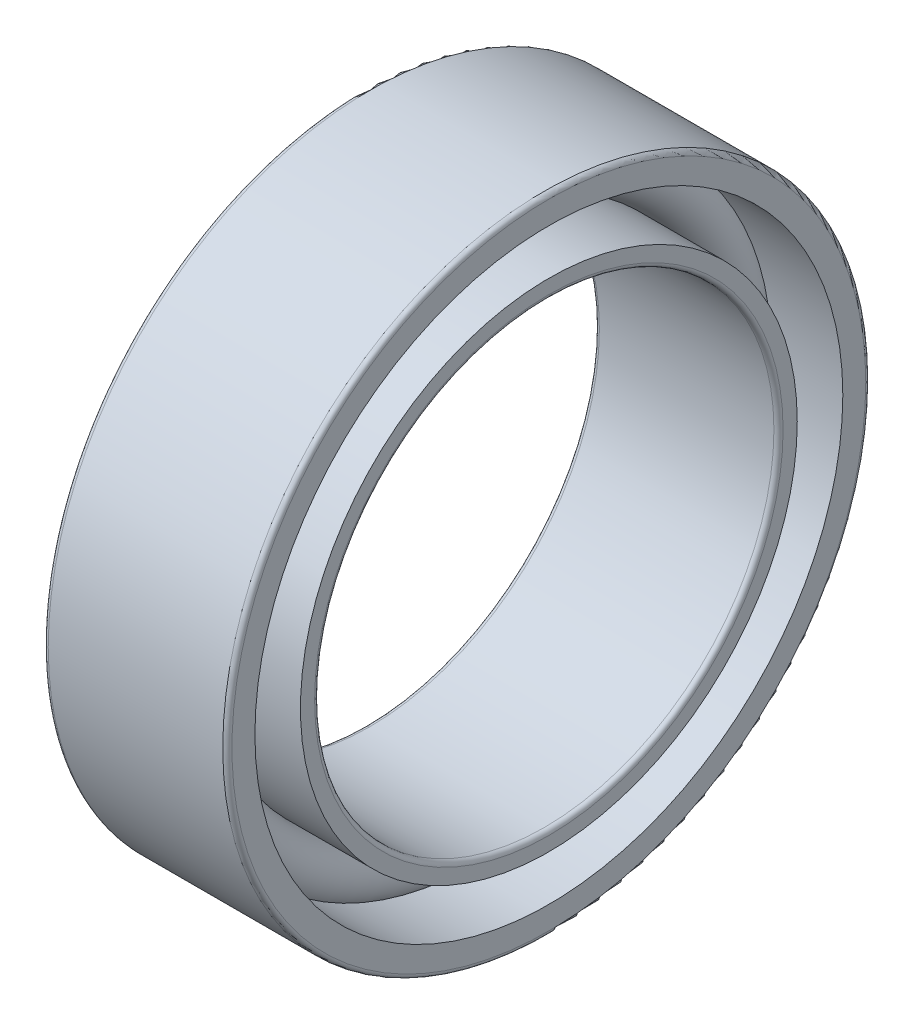
ISO-10303-21;
HEADER;
FILE_DESCRIPTION(('STEP AP214'),'2;1');
FILE_NAME('part.step','',(''),(''),'','','');
FILE_SCHEMA(('AUTOMOTIVE_DESIGN { 1 0 10303 214 1 1 1 1 }'));
ENDSEC;
DATA;
#1=APPLICATION_CONTEXT('core data for automotive mechanical design processes');
#2=APPLICATION_PROTOCOL_DEFINITION('international standard','automotive_design',2000,#1);
#3=PRODUCT_CONTEXT('',#1,'mechanical');
#4=PRODUCT('Part','Part','',(#3));
#5=PRODUCT_RELATED_PRODUCT_CATEGORY('part','',(#4));
#6=PRODUCT_DEFINITION_FORMATION('','',#4);
#7=PRODUCT_DEFINITION_CONTEXT('part definition',#1,'design');
#8=PRODUCT_DEFINITION('design','',#6,#7);
#9=PRODUCT_DEFINITION_SHAPE('','',#8);
#10=(LENGTH_UNIT() NAMED_UNIT(*) SI_UNIT(.MILLI.,.METRE.));
#11=(NAMED_UNIT(*) PLANE_ANGLE_UNIT() SI_UNIT($,.RADIAN.));
#12=(NAMED_UNIT(*) SI_UNIT($,.STERADIAN.) SOLID_ANGLE_UNIT());
#13=UNCERTAINTY_MEASURE_WITH_UNIT(LENGTH_MEASURE(1.E-05),#10,'distance_accuracy_value','');
#14=(GEOMETRIC_REPRESENTATION_CONTEXT(3) GLOBAL_UNCERTAINTY_ASSIGNED_CONTEXT((#13)) GLOBAL_UNIT_ASSIGNED_CONTEXT((#10,
#11,#12)) REPRESENTATION_CONTEXT('',''));
#15=CARTESIAN_POINT('',(0.,0.,0.));
#16=DIRECTION('',(0.,0.,1.));
#17=DIRECTION('',(1.,0.,0.));
#18=AXIS2_PLACEMENT_3D('',#15,#16,#17);
#19=CARTESIAN_POINT('',(0.,0.,0.));
#20=DIRECTION('',(-1.,0.,0.));
#21=DIRECTION('',(0.,0.,1.));
#22=AXIS2_PLACEMENT_3D('',#19,#20,#21);
#23=TOROIDAL_SURFACE('',#22,18.,1.8);
#24=CARTESIAN_POINT('',(1.34164078649987,0.,0.));
#25=DIRECTION('',(-1.,0.,0.));
#26=DIRECTION('',(0.,0.,1.));
#27=AXIS2_PLACEMENT_3D('',#24,#25,#26);
#28=CIRCLE('',#27,19.2);
#29=CARTESIAN_POINT('',(1.34164078649987,0.,19.2));
#30=VERTEX_POINT('',#29);
#31=EDGE_CURVE('E36',#30,#30,#28,.F.);
#32=ORIENTED_EDGE('',*,*,#31,.T.);
#33=EDGE_LOOP('',(#32));
#34=FACE_BOUND('',#33,.T.);
#35=CARTESIAN_POINT('',(0.29895651857754,0.,0.));
#36=DIRECTION('',(-1.,0.,0.));
#37=DIRECTION('',(0.,0.,1.));
#38=AXIS2_PLACEMENT_3D('',#35,#36,#37);
#39=CIRCLE('',#38,16.225);
#40=CARTESIAN_POINT('',(0.29895651857754,0.,16.225));
#41=VERTEX_POINT('',#40);
#42=EDGE_CURVE('E10',#41,#41,#39,.T.);
#43=ORIENTED_EDGE('',*,*,#42,.T.);
#44=EDGE_LOOP('',(#43));
#45=FACE_BOUND('',#44,.T.);
#46=ADVANCED_FACE('F32',(#34,#45),#23,.T.);
#47=CARTESIAN_POINT('',(-20.6375,0.,0.));
#48=DIRECTION('',(1.,0.,0.));
#49=DIRECTION('',(0.,0.,-1.));
#50=AXIS2_PLACEMENT_3D('',#47,#48,#49);
#51=CYLINDRICAL_SURFACE('',#50,16.225);
#52=CARTESIAN_POINT('',(6.,0.,0.));
#53=DIRECTION('',(1.,0.,0.));
#54=DIRECTION('',(0.,0.,-1.));
#55=AXIS2_PLACEMENT_3D('',#52,#53,#54);
#56=CIRCLE('',#55,16.225);
#57=CARTESIAN_POINT('',(6.,0.,-16.225));
#58=VERTEX_POINT('',#57);
#59=EDGE_CURVE('E45',#58,#58,#56,.T.);
#60=ORIENTED_EDGE('',*,*,#59,.F.);
#61=EDGE_LOOP('',(#60));
#62=FACE_BOUND('',#61,.T.);
#63=ORIENTED_EDGE('',*,*,#42,.F.);
#64=EDGE_LOOP('',(#63));
#65=FACE_BOUND('',#64,.T.);
#66=ADVANCED_FACE('F84',(#62,#65),#51,.T.);
#67=CARTESIAN_POINT('',(-20.6375,0.,0.));
#68=DIRECTION('',(1.,0.,0.));
#69=DIRECTION('',(0.,0.,-1.));
#70=AXIS2_PLACEMENT_3D('',#67,#68,#69);
#71=CYLINDRICAL_SURFACE('',#70,16.8);
#72=CARTESIAN_POINT('',(-6.,0.,0.));
#73=DIRECTION('',(1.,0.,0.));
#74=DIRECTION('',(0.,0.,-1.));
#75=AXIS2_PLACEMENT_3D('',#72,#73,#74);
#76=CIRCLE('',#75,16.8);
#77=CARTESIAN_POINT('',(-6.,0.,-16.8));
#78=VERTEX_POINT('',#77);
#79=EDGE_CURVE('E54',#78,#78,#76,.T.);
#80=ORIENTED_EDGE('',*,*,#79,.T.);
#81=EDGE_LOOP('',(#80));
#82=FACE_BOUND('',#81,.T.);
#83=CARTESIAN_POINT('',(-1.34164078649988,0.,0.));
#84=DIRECTION('',(1.,0.,0.));
#85=DIRECTION('',(0.,0.,-1.));
#86=AXIS2_PLACEMENT_3D('',#83,#84,#85);
#87=CIRCLE('',#86,16.8);
#88=CARTESIAN_POINT('',(-1.34164078649988,0.,-16.8));
#89=VERTEX_POINT('',#88);
#90=EDGE_CURVE('E40',#89,#89,#87,.T.);
#91=ORIENTED_EDGE('',*,*,#90,.F.);
#92=EDGE_LOOP('',(#91));
#93=FACE_BOUND('',#92,.T.);
#94=ADVANCED_FACE('F87',(#82,#93),#71,.T.);
#95=CARTESIAN_POINT('',(6.,15.3,0.));
#96=DIRECTION('',(1.,0.,0.));
#97=DIRECTION('',(0.,0.,-1.));
#98=AXIS2_PLACEMENT_3D('',#95,#96,#97);
#99=PLANE('',#98);
#100=ORIENTED_EDGE('',*,*,#59,.T.);
#101=EDGE_LOOP('',(#100));
#102=FACE_BOUND('',#101,.T.);
#103=CARTESIAN_POINT('',(6.,0.,0.));
#104=DIRECTION('',(1.,0.,0.));
#105=DIRECTION('',(0.,0.,-1.));
#106=AXIS2_PLACEMENT_3D('',#103,#104,#105);
#107=CIRCLE('',#106,15.3);
#108=CARTESIAN_POINT('',(6.,0.,-15.3));
#109=VERTEX_POINT('',#108);
#110=EDGE_CURVE('E76',#109,#109,#107,.T.);
#111=ORIENTED_EDGE('',*,*,#110,.F.);
#112=EDGE_LOOP('',(#111));
#113=FACE_BOUND('',#112,.T.);
#114=ADVANCED_FACE('F81',(#102,#113),#99,.T.);
#115=CARTESIAN_POINT('',(5.7,0.,0.));
#116=DIRECTION('',(1.,0.,0.));
#117=DIRECTION('',(0.,0.,-1.));
#118=AXIS2_PLACEMENT_3D('',#115,#116,#117);
#119=TOROIDAL_SURFACE('',#118,15.3,0.299999999999999);
#120=ORIENTED_EDGE('',*,*,#110,.T.);
#121=EDGE_LOOP('',(#120));
#122=FACE_BOUND('',#121,.T.);
#123=CARTESIAN_POINT('',(5.7,0.,0.));
#124=DIRECTION('',(1.,0.,0.));
#125=DIRECTION('',(0.,0.,-1.));
#126=AXIS2_PLACEMENT_3D('',#123,#124,#125);
#127=CIRCLE('',#126,15.);
#128=CARTESIAN_POINT('',(5.7,0.,-15.));
#129=VERTEX_POINT('',#128);
#130=EDGE_CURVE('E73',#129,#129,#127,.T.);
#131=ORIENTED_EDGE('',*,*,#130,.F.);
#132=EDGE_LOOP('',(#131));
#133=FACE_BOUND('',#132,.T.);
#134=ADVANCED_FACE('F98',(#122,#133),#119,.T.);
#135=CARTESIAN_POINT('',(-20.6375,0.,0.));
#136=DIRECTION('',(1.,0.,0.));
#137=DIRECTION('',(0.,0.,-1.));
#138=AXIS2_PLACEMENT_3D('',#135,#136,#137);
#139=CYLINDRICAL_SURFACE('',#138,15.);
#140=ORIENTED_EDGE('',*,*,#130,.T.);
#141=EDGE_LOOP('',(#140));
#142=FACE_BOUND('',#141,.T.);
#143=CARTESIAN_POINT('',(-5.7,0.,0.));
#144=DIRECTION('',(1.,0.,0.));
#145=DIRECTION('',(0.,0.,-1.));
#146=AXIS2_PLACEMENT_3D('',#143,#144,#145);
#147=CIRCLE('',#146,15.);
#148=CARTESIAN_POINT('',(-5.7,0.,-15.));
#149=VERTEX_POINT('',#148);
#150=EDGE_CURVE('E70',#149,#149,#147,.T.);
#151=ORIENTED_EDGE('',*,*,#150,.F.);
#152=EDGE_LOOP('',(#151));
#153=FACE_BOUND('',#152,.T.);
#154=ADVANCED_FACE('F101',(#142,#153),#139,.F.);
#155=CARTESIAN_POINT('',(-5.7,0.,0.));
#156=DIRECTION('',(1.,0.,0.));
#157=DIRECTION('',(0.,0.,-1.));
#158=AXIS2_PLACEMENT_3D('',#155,#156,#157);
#159=TOROIDAL_SURFACE('',#158,15.3,0.299999999999999);
#160=ORIENTED_EDGE('',*,*,#150,.T.);
#161=EDGE_LOOP('',(#160));
#162=FACE_BOUND('',#161,.T.);
#163=CARTESIAN_POINT('',(-6.,0.,0.));
#164=DIRECTION('',(1.,0.,0.));
#165=DIRECTION('',(0.,0.,-1.));
#166=AXIS2_PLACEMENT_3D('',#163,#164,#165);
#167=CIRCLE('',#166,15.3);
#168=CARTESIAN_POINT('',(-6.,0.,-15.3));
#169=VERTEX_POINT('',#168);
#170=EDGE_CURVE('E67',#169,#169,#167,.T.);
#171=ORIENTED_EDGE('',*,*,#170,.F.);
#172=EDGE_LOOP('',(#171));
#173=FACE_BOUND('',#172,.T.);
#174=ADVANCED_FACE('F105',(#162,#173),#159,.T.);
#175=CARTESIAN_POINT('',(-6.,16.8,0.));
#176=DIRECTION('',(-1.,0.,0.));
#177=DIRECTION('',(0.,0.,1.));
#178=AXIS2_PLACEMENT_3D('',#175,#176,#177);
#179=PLANE('',#178);
#180=ORIENTED_EDGE('',*,*,#170,.T.);
#181=EDGE_LOOP('',(#180));
#182=FACE_BOUND('',#181,.T.);
#183=ORIENTED_EDGE('',*,*,#79,.F.);
#184=EDGE_LOOP('',(#183));
#185=FACE_BOUND('',#184,.T.);
#186=ADVANCED_FACE('F109',(#182,#185),#179,.T.);
#187=CARTESIAN_POINT('',(-0.29895651857754,0.,0.));
#188=DIRECTION('',(1.,0.,0.));
#189=DIRECTION('',(0.,0.,-1.));
#190=AXIS2_PLACEMENT_3D('',#187,#188,#189);
#191=CIRCLE('',#190,19.775);
#192=CARTESIAN_POINT('',(-0.29895651857754,0.,-19.775));
#193=VERTEX_POINT('',#192);
#194=EDGE_CURVE('E48',#193,#193,#191,.F.);
#195=ORIENTED_EDGE('',*,*,#194,.T.);
#196=EDGE_LOOP('',(#195));
#197=FACE_BOUND('',#196,.T.);
#198=ORIENTED_EDGE('',*,*,#90,.T.);
#199=EDGE_LOOP('',(#198));
#200=FACE_BOUND('',#199,.T.);
#201=ADVANCED_FACE('F34',(#197,#200),#23,.T.);
#202=CARTESIAN_POINT('',(-20.6375,0.,0.));
#203=DIRECTION('',(1.,0.,0.));
#204=DIRECTION('',(0.,0.,-1.));
#205=AXIS2_PLACEMENT_3D('',#202,#203,#204);
#206=CYLINDRICAL_SURFACE('',#205,19.2);
#207=CARTESIAN_POINT('',(6.,0.,0.));
#208=DIRECTION('',(1.,0.,0.));
#209=DIRECTION('',(0.,0.,-1.));
#210=AXIS2_PLACEMENT_3D('',#207,#208,#209);
#211=CIRCLE('',#210,19.2);
#212=CARTESIAN_POINT('',(6.,0.,-19.2));
#213=VERTEX_POINT('',#212);
#214=EDGE_CURVE('E150',#213,#213,#211,.T.);
#215=ORIENTED_EDGE('',*,*,#214,.T.);
#216=EDGE_LOOP('',(#215));
#217=FACE_BOUND('',#216,.T.);
#218=ORIENTED_EDGE('',*,*,#31,.F.);
#219=EDGE_LOOP('',(#218));
#220=FACE_BOUND('',#219,.T.);
#221=ADVANCED_FACE('F131',(#217,#220),#206,.F.);
#222=CARTESIAN_POINT('',(-20.6375,0.,0.));
#223=DIRECTION('',(1.,0.,0.));
#224=DIRECTION('',(0.,0.,-1.));
#225=AXIS2_PLACEMENT_3D('',#222,#223,#224);
#226=CYLINDRICAL_SURFACE('',#225,19.775);
#227=CARTESIAN_POINT('',(-6.,0.,0.));
#228=DIRECTION('',(1.,0.,0.));
#229=DIRECTION('',(0.,0.,-1.));
#230=AXIS2_PLACEMENT_3D('',#227,#228,#229);
#231=CIRCLE('',#230,19.775);
#232=CARTESIAN_POINT('',(-6.,0.,-19.775));
#233=VERTEX_POINT('',#232);
#234=EDGE_CURVE('E145',#233,#233,#231,.T.);
#235=ORIENTED_EDGE('',*,*,#234,.F.);
#236=EDGE_LOOP('',(#235));
#237=FACE_BOUND('',#236,.T.);
#238=ORIENTED_EDGE('',*,*,#194,.F.);
#239=EDGE_LOOP('',(#238));
#240=FACE_BOUND('',#239,.T.);
#241=ADVANCED_FACE('F118',(#237,#240),#226,.F.);
#242=CARTESIAN_POINT('',(-5.7,0.,0.));
#243=DIRECTION('',(1.,0.,0.));
#244=DIRECTION('',(0.,0.,-1.));
#245=AXIS2_PLACEMENT_3D('',#242,#243,#244);
#246=TOROIDAL_SURFACE('',#245,20.7,0.300000000000006);
#247=CARTESIAN_POINT('',(-6.,0.,0.));
#248=DIRECTION('',(1.,0.,0.));
#249=DIRECTION('',(0.,0.,-1.));
#250=AXIS2_PLACEMENT_3D('',#247,#248,#249);
#251=CIRCLE('',#250,20.7);
#252=CARTESIAN_POINT('',(-6.,0.,-20.7));
#253=VERTEX_POINT('',#252);
#254=EDGE_CURVE('E148',#253,#253,#251,.T.);
#255=ORIENTED_EDGE('',*,*,#254,.T.);
#256=EDGE_LOOP('',(#255));
#257=FACE_BOUND('',#256,.T.);
#258=CARTESIAN_POINT('',(-5.7,0.,0.));
#259=DIRECTION('',(1.,0.,0.));
#260=DIRECTION('',(0.,0.,-1.));
#261=AXIS2_PLACEMENT_3D('',#258,#259,#260);
#262=CIRCLE('',#261,21.);
#263=CARTESIAN_POINT('',(-5.7,0.,-21.));
#264=VERTEX_POINT('',#263);
#265=EDGE_CURVE('E50',#264,#264,#262,.T.);
#266=ORIENTED_EDGE('',*,*,#265,.F.);
#267=EDGE_LOOP('',(#266));
#268=FACE_BOUND('',#267,.T.);
#269=ADVANCED_FACE('F114',(#257,#268),#246,.T.);
#270=CARTESIAN_POINT('',(-20.6375,0.,0.));
#271=DIRECTION('',(1.,0.,0.));
#272=DIRECTION('',(0.,0.,-1.));
#273=AXIS2_PLACEMENT_3D('',#270,#271,#272);
#274=CYLINDRICAL_SURFACE('',#273,21.);
#275=ORIENTED_EDGE('',*,*,#265,.T.);
#276=EDGE_LOOP('',(#275));
#277=FACE_BOUND('',#276,.T.);
#278=CARTESIAN_POINT('',(5.7,0.,0.));
#279=DIRECTION('',(1.,0.,0.));
#280=DIRECTION('',(0.,0.,-1.));
#281=AXIS2_PLACEMENT_3D('',#278,#279,#280);
#282=CIRCLE('',#281,21.);
#283=CARTESIAN_POINT('',(5.7,0.,-21.));
#284=VERTEX_POINT('',#283);
#285=EDGE_CURVE('E56',#284,#284,#282,.T.);
#286=ORIENTED_EDGE('',*,*,#285,.F.);
#287=EDGE_LOOP('',(#286));
#288=FACE_BOUND('',#287,.T.);
#289=ADVANCED_FACE('F117',(#277,#288),#274,.T.);
#290=CARTESIAN_POINT('',(5.7,0.,0.));
#291=DIRECTION('',(1.,0.,0.));
#292=DIRECTION('',(0.,0.,-1.));
#293=AXIS2_PLACEMENT_3D('',#290,#291,#292);
#294=TOROIDAL_SURFACE('',#293,20.7,0.300000000000006);
#295=ORIENTED_EDGE('',*,*,#285,.T.);
#296=EDGE_LOOP('',(#295));
#297=FACE_BOUND('',#296,.T.);
#298=CARTESIAN_POINT('',(6.,0.,0.));
#299=DIRECTION('',(1.,0.,0.));
#300=DIRECTION('',(0.,0.,-1.));
#301=AXIS2_PLACEMENT_3D('',#298,#299,#300);
#302=CIRCLE('',#301,20.7);
#303=CARTESIAN_POINT('',(6.,0.,-20.7));
#304=VERTEX_POINT('',#303);
#305=EDGE_CURVE('E61',#304,#304,#302,.T.);
#306=ORIENTED_EDGE('',*,*,#305,.F.);
#307=EDGE_LOOP('',(#306));
#308=FACE_BOUND('',#307,.T.);
#309=ADVANCED_FACE('F122',(#297,#308),#294,.T.);
#310=CARTESIAN_POINT('',(6.,20.7,0.));
#311=DIRECTION('',(1.,0.,0.));
#312=DIRECTION('',(0.,0.,-1.));
#313=AXIS2_PLACEMENT_3D('',#310,#311,#312);
#314=PLANE('',#313);
#315=ORIENTED_EDGE('',*,*,#305,.T.);
#316=EDGE_LOOP('',(#315));
#317=FACE_BOUND('',#316,.T.);
#318=ORIENTED_EDGE('',*,*,#214,.F.);
#319=EDGE_LOOP('',(#318));
#320=FACE_BOUND('',#319,.T.);
#321=ADVANCED_FACE('F125',(#317,#320),#314,.T.);
#322=CARTESIAN_POINT('',(-6.,19.775,0.));
#323=DIRECTION('',(-1.,0.,0.));
#324=DIRECTION('',(0.,0.,1.));
#325=AXIS2_PLACEMENT_3D('',#322,#323,#324);
#326=PLANE('',#325);
#327=ORIENTED_EDGE('',*,*,#234,.T.);
#328=EDGE_LOOP('',(#327));
#329=FACE_BOUND('',#328,.T.);
#330=ORIENTED_EDGE('',*,*,#254,.F.);
#331=EDGE_LOOP('',(#330));
#332=FACE_BOUND('',#331,.T.);
#333=ADVANCED_FACE('F129',(#329,#332),#326,.T.);
#334=CLOSED_SHELL('',(#46,#66,#94,#114,#134,#154,#174,#186,#201,#221,#241,#269,#289,#309,#321,#333));
#335=MANIFOLD_SOLID_BREP('B2',#334);
#336=ADVANCED_BREP_SHAPE_REPRESENTATION('',(#18,#335),#14);
#337=SHAPE_DEFINITION_REPRESENTATION(#9,#336);
ENDSEC;
END-ISO-10303-21;
